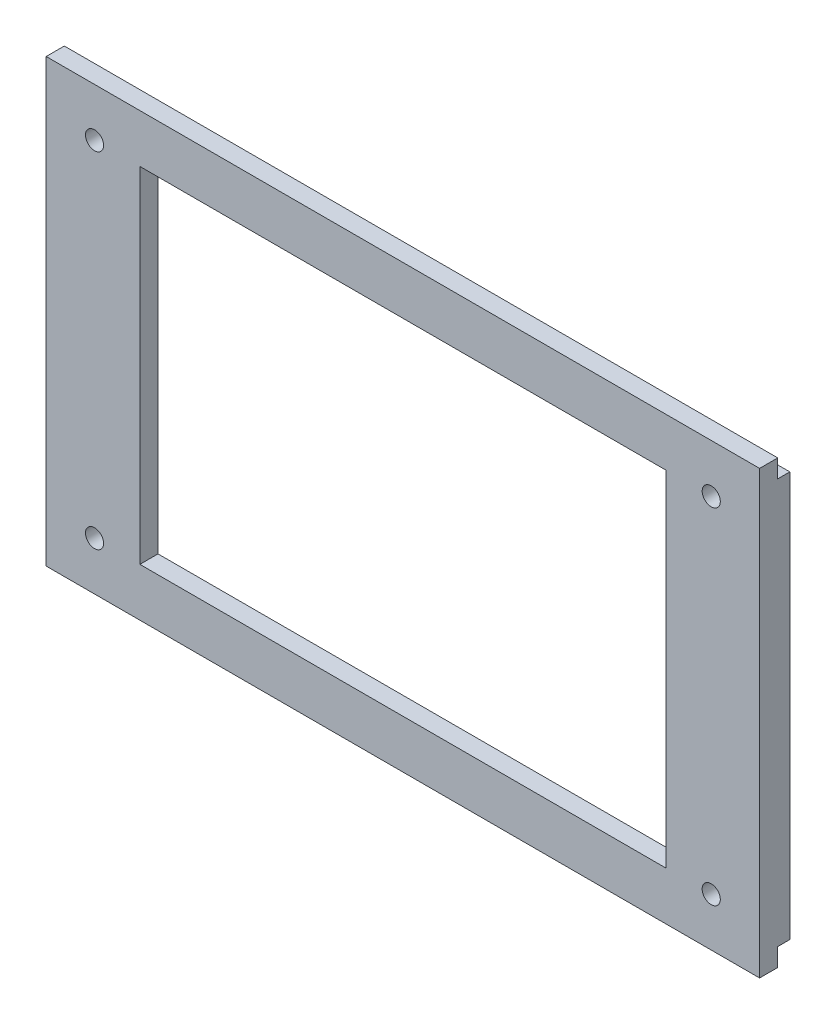
ISO-10303-21;
HEADER;
FILE_DESCRIPTION(('STEP AP214'),'2;1');
FILE_NAME('part.step','',(''),(''),'','','');
FILE_SCHEMA(('AUTOMOTIVE_DESIGN { 1 0 10303 214 1 1 1 1 }'));
ENDSEC;
DATA;
#1=APPLICATION_CONTEXT('core data for automotive mechanical design processes');
#2=APPLICATION_PROTOCOL_DEFINITION('international standard','automotive_design',2000,#1);
#3=PRODUCT_CONTEXT('',#1,'mechanical');
#4=PRODUCT('Part','Part','',(#3));
#5=PRODUCT_RELATED_PRODUCT_CATEGORY('part','',(#4));
#6=PRODUCT_DEFINITION_FORMATION('','',#4);
#7=PRODUCT_DEFINITION_CONTEXT('part definition',#1,'design');
#8=PRODUCT_DEFINITION('design','',#6,#7);
#9=PRODUCT_DEFINITION_SHAPE('','',#8);
#10=(LENGTH_UNIT() NAMED_UNIT(*) SI_UNIT(.MILLI.,.METRE.));
#11=(NAMED_UNIT(*) PLANE_ANGLE_UNIT() SI_UNIT($,.RADIAN.));
#12=(NAMED_UNIT(*) SI_UNIT($,.STERADIAN.) SOLID_ANGLE_UNIT());
#13=UNCERTAINTY_MEASURE_WITH_UNIT(LENGTH_MEASURE(1.E-05),#10,'distance_accuracy_value','');
#14=(GEOMETRIC_REPRESENTATION_CONTEXT(3) GLOBAL_UNCERTAINTY_ASSIGNED_CONTEXT((#13)) GLOBAL_UNIT_ASSIGNED_CONTEXT((#10,
#11,#12)) REPRESENTATION_CONTEXT('',''));
#15=CARTESIAN_POINT('',(0.,0.,0.));
#16=DIRECTION('',(0.,0.,1.));
#17=DIRECTION('',(1.,0.,0.));
#18=AXIS2_PLACEMENT_3D('',#15,#16,#17);
#19=CARTESIAN_POINT('',(0.,0.,0.));
#20=DIRECTION('',(0.,0.,1.));
#21=DIRECTION('',(1.,0.,0.));
#22=AXIS2_PLACEMENT_3D('',#19,#20,#21);
#23=PLANE('',#22);
#24=DIRECTION('',(-1.,0.,0.));
#25=VECTOR('',#24,1.);
#26=CARTESIAN_POINT('',(0.,-43.3442614039705,0.));
#27=LINE('',#26,#25);
#28=CARTESIAN_POINT('',(82.6355153236074,-43.3442614039705,0.));
#29=VERTEX_POINT('',#28);
#30=CARTESIAN_POINT('',(-4.3644846763926,-43.3442614039705,0.));
#31=VERTEX_POINT('',#30);
#32=EDGE_CURVE('E219',#29,#31,#27,.T.);
#33=ORIENTED_EDGE('',*,*,#32,.F.);
#34=DIRECTION('',(0.,-1.,0.));
#35=VECTOR('',#34,1.);
#36=CARTESIAN_POINT('',(82.6355153236074,0.,0.));
#37=LINE('',#36,#35);
#38=CARTESIAN_POINT('',(82.6355153236074,13.6557385960295,0.));
#39=VERTEX_POINT('',#38);
#40=EDGE_CURVE('E169',#39,#29,#37,.T.);
#41=ORIENTED_EDGE('',*,*,#40,.F.);
#42=DIRECTION('',(1.,0.,0.));
#43=VECTOR('',#42,1.);
#44=CARTESIAN_POINT('',(0.,13.6557385960295,0.));
#45=LINE('',#44,#43);
#46=CARTESIAN_POINT('',(-4.3644846763926,13.6557385960295,0.));
#47=VERTEX_POINT('',#46);
#48=EDGE_CURVE('E224',#47,#39,#45,.T.);
#49=ORIENTED_EDGE('',*,*,#48,.F.);
#50=DIRECTION('',(0.,1.,0.));
#51=VECTOR('',#50,1.);
#52=CARTESIAN_POINT('',(-4.3644846763926,0.,0.));
#53=LINE('',#52,#51);
#54=EDGE_CURVE('E222',#31,#47,#53,.T.);
#55=ORIENTED_EDGE('',*,*,#54,.F.);
#56=EDGE_LOOP('',(#33,#41,#49,#55));
#57=FACE_BOUND('',#56,.T.);
#58=CARTESIAN_POINT('',(-11.8644846763926,13.6557385960295,0.));
#59=DIRECTION('',(0.,0.,1.));
#60=DIRECTION('',(1.,0.,0.));
#61=AXIS2_PLACEMENT_3D('',#58,#59,#60);
#62=CIRCLE('',#61,1.5);
#63=CARTESIAN_POINT('',(-10.3644846763926,13.6557385960295,0.));
#64=VERTEX_POINT('',#63);
#65=EDGE_CURVE('E204',#64,#64,#62,.T.);
#66=ORIENTED_EDGE('',*,*,#65,.T.);
#67=EDGE_LOOP('',(#66));
#68=FACE_BOUND('',#67,.T.);
#69=CARTESIAN_POINT('',(90.1355153236074,13.6557385960295,0.));
#70=DIRECTION('',(0.,0.,1.));
#71=DIRECTION('',(1.,0.,0.));
#72=AXIS2_PLACEMENT_3D('',#69,#70,#71);
#73=CIRCLE('',#72,1.5);
#74=CARTESIAN_POINT('',(91.6355153236074,13.6557385960295,0.));
#75=VERTEX_POINT('',#74);
#76=EDGE_CURVE('E201',#75,#75,#73,.T.);
#77=ORIENTED_EDGE('',*,*,#76,.T.);
#78=EDGE_LOOP('',(#77));
#79=FACE_BOUND('',#78,.T.);
#80=CARTESIAN_POINT('',(90.1355153236074,-43.3442614039705,0.));
#81=DIRECTION('',(0.,0.,1.));
#82=DIRECTION('',(1.,0.,0.));
#83=AXIS2_PLACEMENT_3D('',#80,#81,#82);
#84=CIRCLE('',#83,1.5);
#85=CARTESIAN_POINT('',(91.6355153236074,-43.3442614039705,0.));
#86=VERTEX_POINT('',#85);
#87=EDGE_CURVE('E159',#86,#86,#84,.T.);
#88=ORIENTED_EDGE('',*,*,#87,.T.);
#89=EDGE_LOOP('',(#88));
#90=FACE_BOUND('',#89,.T.);
#91=CARTESIAN_POINT('',(-11.8644846763926,-43.3442614039705,0.));
#92=DIRECTION('',(0.,0.,1.));
#93=DIRECTION('',(1.,0.,0.));
#94=AXIS2_PLACEMENT_3D('',#91,#92,#93);
#95=CIRCLE('',#94,1.5);
#96=CARTESIAN_POINT('',(-10.3644846763926,-43.3442614039705,0.));
#97=VERTEX_POINT('',#96);
#98=EDGE_CURVE('E156',#97,#97,#95,.T.);
#99=ORIENTED_EDGE('',*,*,#98,.T.);
#100=EDGE_LOOP('',(#99));
#101=FACE_BOUND('',#100,.T.);
#102=DIRECTION('',(1.,0.,0.));
#103=VECTOR('',#102,1.);
#104=CARTESIAN_POINT('',(95.1355153236074,18.6557385960295,0.));
#105=LINE('',#104,#103);
#106=CARTESIAN_POINT('',(95.1355153236074,18.6557385960295,0.));
#107=VERTEX_POINT('',#106);
#108=CARTESIAN_POINT('',(98.1355153236074,18.6557385960295,0.));
#109=VERTEX_POINT('',#108);
#110=EDGE_CURVE('E60',#107,#109,#105,.T.);
#111=ORIENTED_EDGE('',*,*,#110,.F.);
#112=DIRECTION('',(0.,1.,0.));
#113=VECTOR('',#112,1.);
#114=CARTESIAN_POINT('',(95.1355153236074,-48.3442614039705,0.));
#115=LINE('',#114,#113);
#116=CARTESIAN_POINT('',(95.1355153236074,-48.3442614039705,0.));
#117=VERTEX_POINT('',#116);
#118=EDGE_CURVE('E153',#117,#107,#115,.T.);
#119=ORIENTED_EDGE('',*,*,#118,.F.);
#120=DIRECTION('',(-1.,0.,0.));
#121=VECTOR('',#120,1.);
#122=CARTESIAN_POINT('',(98.1355153236074,-48.3442614039705,0.));
#123=LINE('',#122,#121);
#124=CARTESIAN_POINT('',(98.1355153236074,-48.3442614039705,0.));
#125=VERTEX_POINT('',#124);
#126=EDGE_CURVE('E66',#125,#117,#123,.T.);
#127=ORIENTED_EDGE('',*,*,#126,.F.);
#128=DIRECTION('',(0.,-1.,0.));
#129=VECTOR('',#128,1.);
#130=CARTESIAN_POINT('',(98.1355153236074,0.,0.));
#131=LINE('',#130,#129);
#132=CARTESIAN_POINT('',(98.1355153236074,-51.3442614039705,0.));
#133=VERTEX_POINT('',#132);
#134=EDGE_CURVE('E216',#125,#133,#131,.T.);
#135=ORIENTED_EDGE('',*,*,#134,.T.);
#136=DIRECTION('',(-1.,0.,0.));
#137=VECTOR('',#136,1.);
#138=CARTESIAN_POINT('',(0.,-51.3442614039705,0.));
#139=LINE('',#138,#137);
#140=CARTESIAN_POINT('',(-19.8644846763926,-51.3442614039705,0.));
#141=VERTEX_POINT('',#140);
#142=EDGE_CURVE('E213',#133,#141,#139,.T.);
#143=ORIENTED_EDGE('',*,*,#142,.T.);
#144=DIRECTION('',(0.,-1.,0.));
#145=VECTOR('',#144,1.);
#146=CARTESIAN_POINT('',(-19.8644846763926,0.,0.));
#147=LINE('',#146,#145);
#148=CARTESIAN_POINT('',(-19.8644846763926,21.6557385960295,0.));
#149=VERTEX_POINT('',#148);
#150=EDGE_CURVE('E210',#149,#141,#147,.T.);
#151=ORIENTED_EDGE('',*,*,#150,.F.);
#152=DIRECTION('',(1.,0.,0.));
#153=VECTOR('',#152,1.);
#154=CARTESIAN_POINT('',(0.,21.6557385960295,0.));
#155=LINE('',#154,#153);
#156=CARTESIAN_POINT('',(98.1355153236074,21.6557385960295,0.));
#157=VERTEX_POINT('',#156);
#158=EDGE_CURVE('E207',#149,#157,#155,.T.);
#159=ORIENTED_EDGE('',*,*,#158,.T.);
#160=EDGE_CURVE('E217',#157,#109,#131,.T.);
#161=ORIENTED_EDGE('',*,*,#160,.T.);
#162=EDGE_LOOP('',(#111,#119,#127,#135,#143,#151,#159,#161));
#163=FACE_BOUND('',#162,.T.);
#164=ADVANCED_FACE('F43',(#57,#68,#79,#90,#101,#163),#23,.F.);
#165=CARTESIAN_POINT('',(0.,-43.3442614039705,3.));
#166=DIRECTION('',(0.,-1.,0.));
#167=DIRECTION('',(1.,0.,0.));
#168=AXIS2_PLACEMENT_3D('',#165,#166,#167);
#169=PLANE('',#168);
#170=ORIENTED_EDGE('',*,*,#32,.T.);
#171=DIRECTION('',(0.,0.,-1.));
#172=VECTOR('',#171,1.);
#173=CARTESIAN_POINT('',(-4.3644846763926,-43.3442614039705,3.));
#174=LINE('',#173,#172);
#175=CARTESIAN_POINT('',(-4.3644846763926,-43.3442614039705,3.));
#176=VERTEX_POINT('',#175);
#177=EDGE_CURVE('E11',#176,#31,#174,.T.);
#178=ORIENTED_EDGE('',*,*,#177,.F.);
#179=DIRECTION('',(-1.,0.,0.));
#180=VECTOR('',#179,1.);
#181=CARTESIAN_POINT('',(0.,-43.3442614039705,3.));
#182=LINE('',#181,#180);
#183=CARTESIAN_POINT('',(82.6355153236074,-43.3442614039705,3.));
#184=VERTEX_POINT('',#183);
#185=EDGE_CURVE('E189',#184,#176,#182,.T.);
#186=ORIENTED_EDGE('',*,*,#185,.F.);
#187=DIRECTION('',(0.,0.,-1.));
#188=VECTOR('',#187,1.);
#189=CARTESIAN_POINT('',(82.6355153236074,-43.3442614039705,3.));
#190=LINE('',#189,#188);
#191=EDGE_CURVE('E227',#184,#29,#190,.T.);
#192=ORIENTED_EDGE('',*,*,#191,.T.);
#193=EDGE_LOOP('',(#170,#178,#186,#192));
#194=FACE_BOUND('',#193,.T.);
#195=ADVANCED_FACE('F267',(#194),#169,.F.);
#196=CARTESIAN_POINT('',(-4.3644846763926,0.,3.));
#197=DIRECTION('',(-1.,0.,0.));
#198=DIRECTION('',(0.,0.,1.));
#199=AXIS2_PLACEMENT_3D('',#196,#197,#198);
#200=PLANE('',#199);
#201=ORIENTED_EDGE('',*,*,#54,.T.);
#202=DIRECTION('',(0.,0.,-1.));
#203=VECTOR('',#202,1.);
#204=CARTESIAN_POINT('',(-4.3644846763926,13.6557385960295,3.));
#205=LINE('',#204,#203);
#206=CARTESIAN_POINT('',(-4.3644846763926,13.6557385960295,3.));
#207=VERTEX_POINT('',#206);
#208=EDGE_CURVE('E52',#207,#47,#205,.T.);
#209=ORIENTED_EDGE('',*,*,#208,.F.);
#210=DIRECTION('',(0.,1.,0.));
#211=VECTOR('',#210,1.);
#212=CARTESIAN_POINT('',(-4.3644846763926,0.,3.));
#213=LINE('',#212,#211);
#214=EDGE_CURVE('E192',#176,#207,#213,.T.);
#215=ORIENTED_EDGE('',*,*,#214,.F.);
#216=ORIENTED_EDGE('',*,*,#177,.T.);
#217=EDGE_LOOP('',(#201,#209,#215,#216));
#218=FACE_BOUND('',#217,.T.);
#219=ADVANCED_FACE('F274',(#218),#200,.F.);
#220=CARTESIAN_POINT('',(0.,13.6557385960295,3.));
#221=DIRECTION('',(0.,1.,0.));
#222=DIRECTION('',(0.,0.,1.));
#223=AXIS2_PLACEMENT_3D('',#220,#221,#222);
#224=PLANE('',#223);
#225=ORIENTED_EDGE('',*,*,#48,.T.);
#226=DIRECTION('',(0.,0.,-1.));
#227=VECTOR('',#226,1.);
#228=CARTESIAN_POINT('',(82.6355153236074,13.6557385960295,3.));
#229=LINE('',#228,#227);
#230=CARTESIAN_POINT('',(82.6355153236074,13.6557385960295,3.));
#231=VERTEX_POINT('',#230);
#232=EDGE_CURVE('E230',#231,#39,#229,.T.);
#233=ORIENTED_EDGE('',*,*,#232,.F.);
#234=DIRECTION('',(1.,0.,0.));
#235=VECTOR('',#234,1.);
#236=CARTESIAN_POINT('',(0.,13.6557385960295,3.));
#237=LINE('',#236,#235);
#238=EDGE_CURVE('E194',#207,#231,#237,.T.);
#239=ORIENTED_EDGE('',*,*,#238,.F.);
#240=ORIENTED_EDGE('',*,*,#208,.T.);
#241=EDGE_LOOP('',(#225,#233,#239,#240));
#242=FACE_BOUND('',#241,.T.);
#243=ADVANCED_FACE('F286',(#242),#224,.F.);
#244=CARTESIAN_POINT('',(0.,21.6557385960295,3.));
#245=DIRECTION('',(0.,1.,0.));
#246=DIRECTION('',(0.,0.,1.));
#247=AXIS2_PLACEMENT_3D('',#244,#245,#246);
#248=PLANE('',#247);
#249=ORIENTED_EDGE('',*,*,#158,.F.);
#250=DIRECTION('',(0.,0.,-1.));
#251=VECTOR('',#250,1.);
#252=CARTESIAN_POINT('',(-19.8644846763926,21.6557385960295,3.));
#253=LINE('',#252,#251);
#254=CARTESIAN_POINT('',(-19.8644846763926,21.6557385960295,3.));
#255=VERTEX_POINT('',#254);
#256=EDGE_CURVE('E47',#255,#149,#253,.T.);
#257=ORIENTED_EDGE('',*,*,#256,.F.);
#258=DIRECTION('',(1.,0.,0.));
#259=VECTOR('',#258,1.);
#260=CARTESIAN_POINT('',(0.,21.6557385960295,3.));
#261=LINE('',#260,#259);
#262=CARTESIAN_POINT('',(98.1355153236074,21.6557385960295,3.));
#263=VERTEX_POINT('',#262);
#264=EDGE_CURVE('E178',#255,#263,#261,.T.);
#265=ORIENTED_EDGE('',*,*,#264,.T.);
#266=DIRECTION('',(0.,0.,-1.));
#267=VECTOR('',#266,1.);
#268=CARTESIAN_POINT('',(98.1355153236074,21.6557385960295,3.));
#269=LINE('',#268,#267);
#270=EDGE_CURVE('E197',#263,#157,#269,.T.);
#271=ORIENTED_EDGE('',*,*,#270,.T.);
#272=EDGE_LOOP('',(#249,#257,#265,#271));
#273=FACE_BOUND('',#272,.T.);
#274=ADVANCED_FACE('F249',(#273),#248,.T.);
#275=CARTESIAN_POINT('',(-19.8644846763926,0.,3.));
#276=DIRECTION('',(1.,0.,0.));
#277=DIRECTION('',(0.,1.,0.));
#278=AXIS2_PLACEMENT_3D('',#275,#276,#277);
#279=PLANE('',#278);
#280=ORIENTED_EDGE('',*,*,#150,.T.);
#281=DIRECTION('',(0.,0.,-1.));
#282=VECTOR('',#281,1.);
#283=CARTESIAN_POINT('',(-19.8644846763926,-51.3442614039705,3.));
#284=LINE('',#283,#282);
#285=CARTESIAN_POINT('',(-19.8644846763926,-51.3442614039705,3.));
#286=VERTEX_POINT('',#285);
#287=EDGE_CURVE('E238',#286,#141,#284,.T.);
#288=ORIENTED_EDGE('',*,*,#287,.F.);
#289=DIRECTION('',(0.,-1.,0.));
#290=VECTOR('',#289,1.);
#291=CARTESIAN_POINT('',(-19.8644846763926,0.,3.));
#292=LINE('',#291,#290);
#293=EDGE_CURVE('E181',#255,#286,#292,.T.);
#294=ORIENTED_EDGE('',*,*,#293,.F.);
#295=ORIENTED_EDGE('',*,*,#256,.T.);
#296=EDGE_LOOP('',(#280,#288,#294,#295));
#297=FACE_BOUND('',#296,.T.);
#298=ADVANCED_FACE('F245',(#297),#279,.F.);
#299=CARTESIAN_POINT('',(0.,-51.3442614039705,3.));
#300=DIRECTION('',(0.,-1.,0.));
#301=DIRECTION('',(1.,0.,0.));
#302=AXIS2_PLACEMENT_3D('',#299,#300,#301);
#303=PLANE('',#302);
#304=ORIENTED_EDGE('',*,*,#142,.F.);
#305=DIRECTION('',(0.,0.,-1.));
#306=VECTOR('',#305,1.);
#307=CARTESIAN_POINT('',(98.1355153236074,-51.3442614039705,3.));
#308=LINE('',#307,#306);
#309=CARTESIAN_POINT('',(98.1355153236074,-51.3442614039705,3.));
#310=VERTEX_POINT('',#309);
#311=EDGE_CURVE('E236',#310,#133,#308,.T.);
#312=ORIENTED_EDGE('',*,*,#311,.F.);
#313=DIRECTION('',(-1.,0.,0.));
#314=VECTOR('',#313,1.);
#315=CARTESIAN_POINT('',(0.,-51.3442614039705,3.));
#316=LINE('',#315,#314);
#317=EDGE_CURVE('E183',#310,#286,#316,.T.);
#318=ORIENTED_EDGE('',*,*,#317,.T.);
#319=ORIENTED_EDGE('',*,*,#287,.T.);
#320=EDGE_LOOP('',(#304,#312,#318,#319));
#321=FACE_BOUND('',#320,.T.);
#322=ADVANCED_FACE('F255',(#321),#303,.T.);
#323=CARTESIAN_POINT('',(98.1355153236074,0.,3.));
#324=DIRECTION('',(1.,0.,0.));
#325=DIRECTION('',(0.,0.,-1.));
#326=AXIS2_PLACEMENT_3D('',#323,#324,#325);
#327=PLANE('',#326);
#328=ORIENTED_EDGE('',*,*,#160,.F.);
#329=ORIENTED_EDGE('',*,*,#270,.F.);
#330=DIRECTION('',(0.,-1.,0.));
#331=VECTOR('',#330,1.);
#332=CARTESIAN_POINT('',(98.1355153236074,0.,3.));
#333=LINE('',#332,#331);
#334=EDGE_CURVE('E186',#263,#310,#333,.T.);
#335=ORIENTED_EDGE('',*,*,#334,.T.);
#336=ORIENTED_EDGE('',*,*,#311,.T.);
#337=ORIENTED_EDGE('',*,*,#134,.F.);
#338=DIRECTION('',(0.,0.,1.));
#339=VECTOR('',#338,1.);
#340=CARTESIAN_POINT('',(98.1355153236074,-48.3442614039705,-2.));
#341=LINE('',#340,#339);
#342=CARTESIAN_POINT('',(98.1355153236074,-48.3442614039705,-2.));
#343=VERTEX_POINT('',#342);
#344=EDGE_CURVE('E140',#343,#125,#341,.T.);
#345=ORIENTED_EDGE('',*,*,#344,.F.);
#346=DIRECTION('',(0.,-1.,0.));
#347=VECTOR('',#346,1.);
#348=CARTESIAN_POINT('',(98.1355153236074,18.6557385960295,-2.));
#349=LINE('',#348,#347);
#350=CARTESIAN_POINT('',(98.1355153236074,18.6557385960295,-2.));
#351=VERTEX_POINT('',#350);
#352=EDGE_CURVE('E133',#351,#343,#349,.T.);
#353=ORIENTED_EDGE('',*,*,#352,.F.);
#354=DIRECTION('',(0.,0.,1.));
#355=VECTOR('',#354,1.);
#356=CARTESIAN_POINT('',(98.1355153236074,18.6557385960295,-2.));
#357=LINE('',#356,#355);
#358=EDGE_CURVE('E138',#351,#109,#357,.T.);
#359=ORIENTED_EDGE('',*,*,#358,.T.);
#360=EDGE_LOOP('',(#328,#329,#335,#336,#337,#345,#353,#359));
#361=FACE_BOUND('',#360,.T.);
#362=ADVANCED_FACE('F136',(#361),#327,.T.);
#363=CARTESIAN_POINT('',(-11.8644846763926,13.6557385960295,3.));
#364=DIRECTION('',(0.,0.,-1.));
#365=DIRECTION('',(-1.,0.,0.));
#366=AXIS2_PLACEMENT_3D('',#363,#364,#365);
#367=CYLINDRICAL_SURFACE('',#366,1.5);
#368=CARTESIAN_POINT('',(-11.8644846763926,13.6557385960295,3.));
#369=DIRECTION('',(0.,0.,1.));
#370=DIRECTION('',(1.,0.,0.));
#371=AXIS2_PLACEMENT_3D('',#368,#369,#370);
#372=CIRCLE('',#371,1.5);
#373=CARTESIAN_POINT('',(-10.3644846763926,13.6557385960295,3.));
#374=VERTEX_POINT('',#373);
#375=EDGE_CURVE('E175',#374,#374,#372,.T.);
#376=ORIENTED_EDGE('',*,*,#375,.T.);
#377=EDGE_LOOP('',(#376));
#378=FACE_BOUND('',#377,.T.);
#379=ORIENTED_EDGE('',*,*,#65,.F.);
#380=EDGE_LOOP('',(#379));
#381=FACE_BOUND('',#380,.T.);
#382=ADVANCED_FACE('F263',(#378,#381),#367,.F.);
#383=CARTESIAN_POINT('',(90.1355153236074,13.6557385960295,3.));
#384=DIRECTION('',(0.,0.,-1.));
#385=DIRECTION('',(-1.,0.,0.));
#386=AXIS2_PLACEMENT_3D('',#383,#384,#385);
#387=CYLINDRICAL_SURFACE('',#386,1.5);
#388=CARTESIAN_POINT('',(90.1355153236074,13.6557385960295,3.));
#389=DIRECTION('',(0.,0.,1.));
#390=DIRECTION('',(1.,0.,0.));
#391=AXIS2_PLACEMENT_3D('',#388,#389,#390);
#392=CIRCLE('',#391,1.5);
#393=CARTESIAN_POINT('',(91.6355153236074,13.6557385960295,3.));
#394=VERTEX_POINT('',#393);
#395=EDGE_CURVE('E172',#394,#394,#392,.T.);
#396=ORIENTED_EDGE('',*,*,#395,.T.);
#397=EDGE_LOOP('',(#396));
#398=FACE_BOUND('',#397,.T.);
#399=ORIENTED_EDGE('',*,*,#76,.F.);
#400=EDGE_LOOP('',(#399));
#401=FACE_BOUND('',#400,.T.);
#402=ADVANCED_FACE('F317',(#398,#401),#387,.F.);
#403=CARTESIAN_POINT('',(90.1355153236074,-43.3442614039705,3.));
#404=DIRECTION('',(0.,0.,-1.));
#405=DIRECTION('',(-1.,0.,0.));
#406=AXIS2_PLACEMENT_3D('',#403,#404,#405);
#407=CYLINDRICAL_SURFACE('',#406,1.5);
#408=CARTESIAN_POINT('',(90.1355153236074,-43.3442614039705,3.));
#409=DIRECTION('',(0.,0.,1.));
#410=DIRECTION('',(1.,0.,0.));
#411=AXIS2_PLACEMENT_3D('',#408,#409,#410);
#412=CIRCLE('',#411,1.5);
#413=CARTESIAN_POINT('',(91.6355153236074,-43.3442614039705,3.));
#414=VERTEX_POINT('',#413);
#415=EDGE_CURVE('E168',#414,#414,#412,.T.);
#416=ORIENTED_EDGE('',*,*,#415,.T.);
#417=EDGE_LOOP('',(#416));
#418=FACE_BOUND('',#417,.T.);
#419=ORIENTED_EDGE('',*,*,#87,.F.);
#420=EDGE_LOOP('',(#419));
#421=FACE_BOUND('',#420,.T.);
#422=ADVANCED_FACE('F328',(#418,#421),#407,.F.);
#423=CARTESIAN_POINT('',(-11.8644846763926,-43.3442614039705,3.));
#424=DIRECTION('',(0.,0.,-1.));
#425=DIRECTION('',(-1.,0.,0.));
#426=AXIS2_PLACEMENT_3D('',#423,#424,#425);
#427=CYLINDRICAL_SURFACE('',#426,1.5);
#428=CARTESIAN_POINT('',(-11.8644846763926,-43.3442614039705,3.));
#429=DIRECTION('',(0.,0.,1.));
#430=DIRECTION('',(1.,0.,0.));
#431=AXIS2_PLACEMENT_3D('',#428,#429,#430);
#432=CIRCLE('',#431,1.5);
#433=CARTESIAN_POINT('',(-10.3644846763926,-43.3442614039705,3.));
#434=VERTEX_POINT('',#433);
#435=EDGE_CURVE('E165',#434,#434,#432,.T.);
#436=ORIENTED_EDGE('',*,*,#435,.T.);
#437=EDGE_LOOP('',(#436));
#438=FACE_BOUND('',#437,.T.);
#439=ORIENTED_EDGE('',*,*,#98,.F.);
#440=EDGE_LOOP('',(#439));
#441=FACE_BOUND('',#440,.T.);
#442=ADVANCED_FACE('F45',(#438,#441),#427,.F.);
#443=CARTESIAN_POINT('',(82.6355153236074,0.,3.));
#444=DIRECTION('',(1.,0.,0.));
#445=DIRECTION('',(0.,0.,-1.));
#446=AXIS2_PLACEMENT_3D('',#443,#444,#445);
#447=PLANE('',#446);
#448=ORIENTED_EDGE('',*,*,#40,.T.);
#449=ORIENTED_EDGE('',*,*,#191,.F.);
#450=DIRECTION('',(0.,-1.,0.));
#451=VECTOR('',#450,1.);
#452=CARTESIAN_POINT('',(82.6355153236074,0.,3.));
#453=LINE('',#452,#451);
#454=EDGE_CURVE('E196',#231,#184,#453,.T.);
#455=ORIENTED_EDGE('',*,*,#454,.F.);
#456=ORIENTED_EDGE('',*,*,#232,.T.);
#457=EDGE_LOOP('',(#448,#449,#455,#456));
#458=FACE_BOUND('',#457,.T.);
#459=ADVANCED_FACE('F282',(#458),#447,.F.);
#460=CARTESIAN_POINT('',(0.,0.,3.));
#461=DIRECTION('',(0.,0.,1.));
#462=DIRECTION('',(1.,0.,0.));
#463=AXIS2_PLACEMENT_3D('',#460,#461,#462);
#464=PLANE('',#463);
#465=ORIENTED_EDGE('',*,*,#435,.F.);
#466=EDGE_LOOP('',(#465));
#467=FACE_BOUND('',#466,.T.);
#468=ORIENTED_EDGE('',*,*,#415,.F.);
#469=EDGE_LOOP('',(#468));
#470=FACE_BOUND('',#469,.T.);
#471=ORIENTED_EDGE('',*,*,#395,.F.);
#472=EDGE_LOOP('',(#471));
#473=FACE_BOUND('',#472,.T.);
#474=ORIENTED_EDGE('',*,*,#375,.F.);
#475=EDGE_LOOP('',(#474));
#476=FACE_BOUND('',#475,.T.);
#477=ORIENTED_EDGE('',*,*,#264,.F.);
#478=ORIENTED_EDGE('',*,*,#293,.T.);
#479=ORIENTED_EDGE('',*,*,#317,.F.);
#480=ORIENTED_EDGE('',*,*,#334,.F.);
#481=EDGE_LOOP('',(#477,#478,#479,#480));
#482=FACE_BOUND('',#481,.T.);
#483=ORIENTED_EDGE('',*,*,#185,.T.);
#484=ORIENTED_EDGE('',*,*,#214,.T.);
#485=ORIENTED_EDGE('',*,*,#238,.T.);
#486=ORIENTED_EDGE('',*,*,#454,.T.);
#487=EDGE_LOOP('',(#483,#484,#485,#486));
#488=FACE_BOUND('',#487,.T.);
#489=ADVANCED_FACE('F253',(#467,#470,#473,#476,#482,#488),#464,.T.);
#490=CARTESIAN_POINT('',(95.1355153236074,18.6557385960295,-2.));
#491=DIRECTION('',(0.,-1.,0.));
#492=DIRECTION('',(1.,0.,0.));
#493=AXIS2_PLACEMENT_3D('',#490,#491,#492);
#494=PLANE('',#493);
#495=ORIENTED_EDGE('',*,*,#110,.T.);
#496=ORIENTED_EDGE('',*,*,#358,.F.);
#497=DIRECTION('',(1.,0.,0.));
#498=VECTOR('',#497,1.);
#499=CARTESIAN_POINT('',(95.1355153236074,18.6557385960295,-2.));
#500=LINE('',#499,#498);
#501=CARTESIAN_POINT('',(95.1355153236074,18.6557385960295,-2.));
#502=VERTEX_POINT('',#501);
#503=EDGE_CURVE('E144',#502,#351,#500,.T.);
#504=ORIENTED_EDGE('',*,*,#503,.F.);
#505=DIRECTION('',(0.,0.,1.));
#506=VECTOR('',#505,1.);
#507=CARTESIAN_POINT('',(95.1355153236074,18.6557385960295,-2.));
#508=LINE('',#507,#506);
#509=EDGE_CURVE('E450',#502,#107,#508,.T.);
#510=ORIENTED_EDGE('',*,*,#509,.T.);
#511=EDGE_LOOP('',(#495,#496,#504,#510));
#512=FACE_BOUND('',#511,.T.);
#513=ADVANCED_FACE('F155',(#512),#494,.F.);
#514=CARTESIAN_POINT('',(98.1355153236074,-48.3442614039705,-2.));
#515=DIRECTION('',(0.,1.,0.));
#516=DIRECTION('',(0.,0.,1.));
#517=AXIS2_PLACEMENT_3D('',#514,#515,#516);
#518=PLANE('',#517);
#519=ORIENTED_EDGE('',*,*,#126,.T.);
#520=DIRECTION('',(0.,0.,1.));
#521=VECTOR('',#520,1.);
#522=CARTESIAN_POINT('',(95.1355153236074,-48.3442614039705,-2.));
#523=LINE('',#522,#521);
#524=CARTESIAN_POINT('',(95.1355153236074,-48.3442614039705,-2.));
#525=VERTEX_POINT('',#524);
#526=EDGE_CURVE('E161',#525,#117,#523,.T.);
#527=ORIENTED_EDGE('',*,*,#526,.F.);
#528=DIRECTION('',(-1.,0.,0.));
#529=VECTOR('',#528,1.);
#530=CARTESIAN_POINT('',(98.1355153236074,-48.3442614039705,-2.));
#531=LINE('',#530,#529);
#532=EDGE_CURVE('E143',#343,#525,#531,.T.);
#533=ORIENTED_EDGE('',*,*,#532,.F.);
#534=ORIENTED_EDGE('',*,*,#344,.T.);
#535=EDGE_LOOP('',(#519,#527,#533,#534));
#536=FACE_BOUND('',#535,.T.);
#537=ADVANCED_FACE('F307',(#536),#518,.F.);
#538=CARTESIAN_POINT('',(95.1355153236074,-48.3442614039705,-2.));
#539=DIRECTION('',(1.,0.,0.));
#540=DIRECTION('',(0.,0.,-1.));
#541=AXIS2_PLACEMENT_3D('',#538,#539,#540);
#542=PLANE('',#541);
#543=ORIENTED_EDGE('',*,*,#118,.T.);
#544=ORIENTED_EDGE('',*,*,#509,.F.);
#545=DIRECTION('',(0.,1.,0.));
#546=VECTOR('',#545,1.);
#547=CARTESIAN_POINT('',(95.1355153236074,-48.3442614039705,-2.));
#548=LINE('',#547,#546);
#549=EDGE_CURVE('E149',#525,#502,#548,.T.);
#550=ORIENTED_EDGE('',*,*,#549,.F.);
#551=ORIENTED_EDGE('',*,*,#526,.T.);
#552=EDGE_LOOP('',(#543,#544,#550,#551));
#553=FACE_BOUND('',#552,.T.);
#554=ADVANCED_FACE('F425',(#553),#542,.F.);
#555=CARTESIAN_POINT('',(0.,0.,-2.));
#556=DIRECTION('',(0.,0.,-1.));
#557=DIRECTION('',(-1.,0.,0.));
#558=AXIS2_PLACEMENT_3D('',#555,#556,#557);
#559=PLANE('',#558);
#560=ORIENTED_EDGE('',*,*,#503,.T.);
#561=ORIENTED_EDGE('',*,*,#352,.T.);
#562=ORIENTED_EDGE('',*,*,#532,.T.);
#563=ORIENTED_EDGE('',*,*,#549,.T.);
#564=EDGE_LOOP('',(#560,#561,#562,#563));
#565=FACE_BOUND('',#564,.T.);
#566=ADVANCED_FACE('F147',(#565),#559,.T.);
#567=CLOSED_SHELL('',(#164,#195,#219,#243,#274,#298,#322,#362,#382,#402,#422,#442,#459,#489,
#513,#537,#554,#566));
#568=MANIFOLD_SOLID_BREP('B2',#567);
#569=ADVANCED_BREP_SHAPE_REPRESENTATION('',(#18,#568),#14);
#570=SHAPE_DEFINITION_REPRESENTATION(#9,#569);
ENDSEC;
END-ISO-10303-21;
